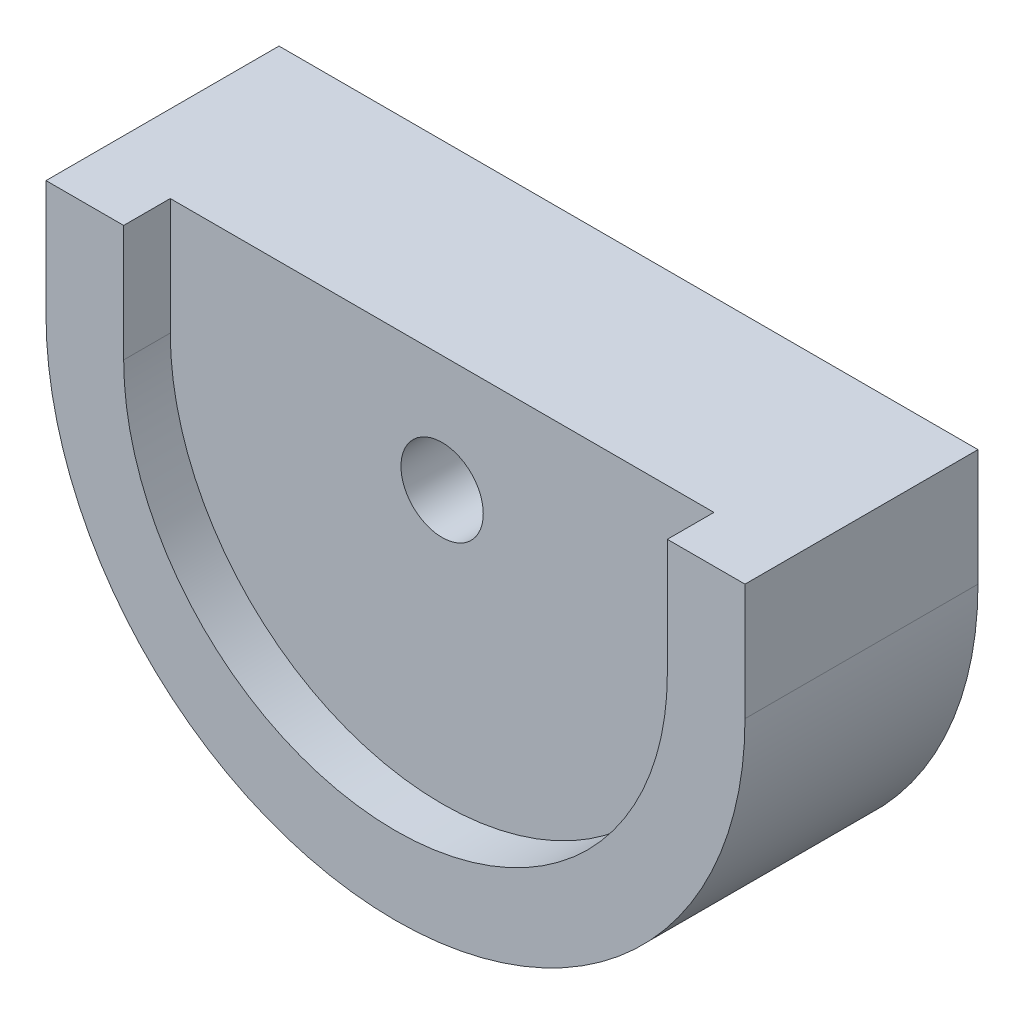
ISO-10303-21;
HEADER;
FILE_DESCRIPTION(('STEP AP214'),'2;1');
FILE_NAME('part.step','',(''),(''),'','','');
FILE_SCHEMA(('AUTOMOTIVE_DESIGN { 1 0 10303 214 1 1 1 1 }'));
ENDSEC;
DATA;
#1=APPLICATION_CONTEXT('core data for automotive mechanical design processes');
#2=APPLICATION_PROTOCOL_DEFINITION('international standard','automotive_design',2000,#1);
#3=PRODUCT_CONTEXT('',#1,'mechanical');
#4=PRODUCT('Part','Part','',(#3));
#5=PRODUCT_RELATED_PRODUCT_CATEGORY('part','',(#4));
#6=PRODUCT_DEFINITION_FORMATION('','',#4);
#7=PRODUCT_DEFINITION_CONTEXT('part definition',#1,'design');
#8=PRODUCT_DEFINITION('design','',#6,#7);
#9=PRODUCT_DEFINITION_SHAPE('','',#8);
#10=(LENGTH_UNIT() NAMED_UNIT(*) SI_UNIT(.MILLI.,.METRE.));
#11=(NAMED_UNIT(*) PLANE_ANGLE_UNIT() SI_UNIT($,.RADIAN.));
#12=(NAMED_UNIT(*) SI_UNIT($,.STERADIAN.) SOLID_ANGLE_UNIT());
#13=UNCERTAINTY_MEASURE_WITH_UNIT(LENGTH_MEASURE(1.E-05),#10,'distance_accuracy_value','');
#14=(GEOMETRIC_REPRESENTATION_CONTEXT(3) GLOBAL_UNCERTAINTY_ASSIGNED_CONTEXT((#13)) GLOBAL_UNIT_ASSIGNED_CONTEXT((#10,
#11,#12)) REPRESENTATION_CONTEXT('',''));
#15=CARTESIAN_POINT('',(0.,0.,0.));
#16=DIRECTION('',(0.,0.,1.));
#17=DIRECTION('',(1.,0.,0.));
#18=AXIS2_PLACEMENT_3D('',#15,#16,#17);
#19=CARTESIAN_POINT('',(22.5,0.,25.));
#20=DIRECTION('',(-1.,0.,0.));
#21=DIRECTION('',(0.,0.,1.));
#22=AXIS2_PLACEMENT_3D('',#19,#20,#21);
#23=PLANE('',#22);
#24=DIRECTION('',(0.,-1.,0.));
#25=VECTOR('',#24,1.);
#26=CARTESIAN_POINT('',(22.5,0.,10.));
#27=LINE('',#26,#25);
#28=CARTESIAN_POINT('',(22.5,7.5,10.));
#29=VERTEX_POINT('',#28);
#30=CARTESIAN_POINT('',(22.5,0.,10.));
#31=VERTEX_POINT('',#30);
#32=EDGE_CURVE('E105',#29,#31,#27,.T.);
#33=ORIENTED_EDGE('',*,*,#32,.F.);
#34=DIRECTION('',(0.,0.,-1.));
#35=VECTOR('',#34,1.);
#36=CARTESIAN_POINT('',(22.5,7.5,42.));
#37=LINE('',#36,#35);
#38=CARTESIAN_POINT('',(22.5,7.5,25.));
#39=VERTEX_POINT('',#38);
#40=EDGE_CURVE('E113',#39,#29,#37,.T.);
#41=ORIENTED_EDGE('',*,*,#40,.F.);
#42=DIRECTION('',(0.,1.,0.));
#43=VECTOR('',#42,1.);
#44=CARTESIAN_POINT('',(22.5,0.,25.));
#45=LINE('',#44,#43);
#46=CARTESIAN_POINT('',(22.5,0.,25.));
#47=VERTEX_POINT('',#46);
#48=EDGE_CURVE('E160',#47,#39,#45,.T.);
#49=ORIENTED_EDGE('',*,*,#48,.F.);
#50=DIRECTION('',(0.,0.,-1.));
#51=VECTOR('',#50,1.);
#52=CARTESIAN_POINT('',(22.5,0.,25.));
#53=LINE('',#52,#51);
#54=EDGE_CURVE('E48',#47,#31,#53,.T.);
#55=ORIENTED_EDGE('',*,*,#54,.T.);
#56=EDGE_LOOP('',(#33,#41,#49,#55));
#57=FACE_BOUND('',#56,.T.);
#58=ADVANCED_FACE('F39',(#57),#23,.F.);
#59=CARTESIAN_POINT('',(-22.5,0.,25.));
#60=DIRECTION('',(1.,0.,0.));
#61=DIRECTION('',(0.,0.,-1.));
#62=AXIS2_PLACEMENT_3D('',#59,#60,#61);
#63=PLANE('',#62);
#64=DIRECTION('',(0.,1.,0.));
#65=VECTOR('',#64,1.);
#66=CARTESIAN_POINT('',(-22.5,0.,10.));
#67=LINE('',#66,#65);
#68=CARTESIAN_POINT('',(-22.5,0.,10.));
#69=VERTEX_POINT('',#68);
#70=CARTESIAN_POINT('',(-22.5,7.5,10.));
#71=VERTEX_POINT('',#70);
#72=EDGE_CURVE('E56',#69,#71,#67,.T.);
#73=ORIENTED_EDGE('',*,*,#72,.F.);
#74=DIRECTION('',(0.,0.,-1.));
#75=VECTOR('',#74,1.);
#76=CARTESIAN_POINT('',(-22.5,0.,25.));
#77=LINE('',#76,#75);
#78=CARTESIAN_POINT('',(-22.5,0.,25.));
#79=VERTEX_POINT('',#78);
#80=EDGE_CURVE('E164',#79,#69,#77,.T.);
#81=ORIENTED_EDGE('',*,*,#80,.F.);
#82=DIRECTION('',(0.,-1.,0.));
#83=VECTOR('',#82,1.);
#84=CARTESIAN_POINT('',(-22.5,0.,25.));
#85=LINE('',#84,#83);
#86=CARTESIAN_POINT('',(-22.5,7.5,25.));
#87=VERTEX_POINT('',#86);
#88=EDGE_CURVE('E162',#87,#79,#85,.T.);
#89=ORIENTED_EDGE('',*,*,#88,.F.);
#90=DIRECTION('',(0.,0.,-1.));
#91=VECTOR('',#90,1.);
#92=CARTESIAN_POINT('',(-22.5,7.5,42.));
#93=LINE('',#92,#91);
#94=EDGE_CURVE('E121',#87,#71,#93,.T.);
#95=ORIENTED_EDGE('',*,*,#94,.T.);
#96=EDGE_LOOP('',(#73,#81,#89,#95));
#97=FACE_BOUND('',#96,.T.);
#98=ADVANCED_FACE('F179',(#97),#63,.F.);
#99=CARTESIAN_POINT('',(0.,0.,25.));
#100=DIRECTION('',(0.,0.,-1.));
#101=DIRECTION('',(-1.,0.,0.));
#102=AXIS2_PLACEMENT_3D('',#99,#100,#101);
#103=CYLINDRICAL_SURFACE('',#102,22.5);
#104=CARTESIAN_POINT('',(0.,0.,10.));
#105=DIRECTION('',(0.,0.,-1.));
#106=DIRECTION('',(-1.,0.,0.));
#107=AXIS2_PLACEMENT_3D('',#104,#105,#106);
#108=CIRCLE('',#107,22.5);
#109=EDGE_CURVE('E116',#31,#69,#108,.T.);
#110=ORIENTED_EDGE('',*,*,#109,.F.);
#111=ORIENTED_EDGE('',*,*,#54,.F.);
#112=CARTESIAN_POINT('',(0.,0.,25.));
#113=DIRECTION('',(0.,0.,1.));
#114=DIRECTION('',(1.,0.,0.));
#115=AXIS2_PLACEMENT_3D('',#112,#113,#114);
#116=CIRCLE('',#115,22.5);
#117=EDGE_CURVE('E155',#79,#47,#116,.T.);
#118=ORIENTED_EDGE('',*,*,#117,.F.);
#119=ORIENTED_EDGE('',*,*,#80,.T.);
#120=EDGE_LOOP('',(#110,#111,#118,#119));
#121=FACE_BOUND('',#120,.T.);
#122=ADVANCED_FACE('F41',(#121),#103,.T.);
#123=CARTESIAN_POINT('',(-22.5,7.5,42.));
#124=DIRECTION('',(0.,1.,0.));
#125=DIRECTION('',(0.,0.,1.));
#126=AXIS2_PLACEMENT_3D('',#123,#124,#125);
#127=PLANE('',#126);
#128=ORIENTED_EDGE('',*,*,#40,.T.);
#129=DIRECTION('',(-1.,0.,0.));
#130=VECTOR('',#129,1.);
#131=CARTESIAN_POINT('',(-22.5,7.5,10.));
#132=LINE('',#131,#130);
#133=EDGE_CURVE('E102',#29,#71,#132,.T.);
#134=ORIENTED_EDGE('',*,*,#133,.T.);
#135=ORIENTED_EDGE('',*,*,#94,.F.);
#136=DIRECTION('',(-1.,0.,0.));
#137=VECTOR('',#136,1.);
#138=CARTESIAN_POINT('',(0.,7.5,25.));
#139=LINE('',#138,#137);
#140=CARTESIAN_POINT('',(-17.5,7.5,25.));
#141=VERTEX_POINT('',#140);
#142=EDGE_CURVE('E134',#141,#87,#139,.T.);
#143=ORIENTED_EDGE('',*,*,#142,.F.);
#144=DIRECTION('',(0.,0.,-1.));
#145=VECTOR('',#144,1.);
#146=CARTESIAN_POINT('',(-17.5,7.5,22.));
#147=LINE('',#146,#145);
#148=CARTESIAN_POINT('',(-17.5,7.5,22.));
#149=VERTEX_POINT('',#148);
#150=EDGE_CURVE('E64',#141,#149,#147,.T.);
#151=ORIENTED_EDGE('',*,*,#150,.T.);
#152=DIRECTION('',(-1.,0.,0.));
#153=VECTOR('',#152,1.);
#154=CARTESIAN_POINT('',(0.,7.5,22.));
#155=LINE('',#154,#153);
#156=CARTESIAN_POINT('',(17.5,7.5,22.));
#157=VERTEX_POINT('',#156);
#158=EDGE_CURVE('E11',#157,#149,#155,.T.);
#159=ORIENTED_EDGE('',*,*,#158,.F.);
#160=DIRECTION('',(0.,0.,-1.));
#161=VECTOR('',#160,1.);
#162=CARTESIAN_POINT('',(17.5,7.5,22.));
#163=LINE('',#162,#161);
#164=CARTESIAN_POINT('',(17.5,7.5,25.));
#165=VERTEX_POINT('',#164);
#166=EDGE_CURVE('E124',#165,#157,#163,.T.);
#167=ORIENTED_EDGE('',*,*,#166,.F.);
#168=EDGE_CURVE('E120',#39,#165,#139,.T.);
#169=ORIENTED_EDGE('',*,*,#168,.F.);
#170=EDGE_LOOP('',(#128,#134,#135,#143,#151,#159,#167,#169));
#171=FACE_BOUND('',#170,.T.);
#172=ADVANCED_FACE('F118',(#171),#127,.T.);
#173=CARTESIAN_POINT('',(0.,0.,15.));
#174=DIRECTION('',(0.,0.,-1.));
#175=DIRECTION('',(-1.,0.,0.));
#176=AXIS2_PLACEMENT_3D('',#173,#174,#175);
#177=CYLINDRICAL_SURFACE('',#176,4.75);
#178=CARTESIAN_POINT('',(0.,0.,15.));
#179=DIRECTION('',(0.,0.,-1.));
#180=DIRECTION('',(-1.,0.,0.));
#181=AXIS2_PLACEMENT_3D('',#178,#179,#180);
#182=CIRCLE('',#181,4.75);
#183=CARTESIAN_POINT('',(-4.75,0.,15.));
#184=VERTEX_POINT('',#183);
#185=EDGE_CURVE('E168',#184,#184,#182,.T.);
#186=ORIENTED_EDGE('',*,*,#185,.F.);
#187=EDGE_LOOP('',(#186));
#188=FACE_BOUND('',#187,.T.);
#189=CARTESIAN_POINT('',(0.,0.,10.));
#190=DIRECTION('',(0.,0.,-1.));
#191=DIRECTION('',(-1.,0.,0.));
#192=AXIS2_PLACEMENT_3D('',#189,#190,#191);
#193=CIRCLE('',#192,4.75);
#194=CARTESIAN_POINT('',(-4.75,0.,10.));
#195=VERTEX_POINT('',#194);
#196=EDGE_CURVE('E43',#195,#195,#193,.F.);
#197=ORIENTED_EDGE('',*,*,#196,.F.);
#198=EDGE_LOOP('',(#197));
#199=FACE_BOUND('',#198,.T.);
#200=ADVANCED_FACE('F231',(#188,#199),#177,.F.);
#201=CARTESIAN_POINT('',(0.,0.,-13.));
#202=DIRECTION('',(0.,0.,1.));
#203=DIRECTION('',(1.,0.,0.));
#204=AXIS2_PLACEMENT_3D('',#201,#202,#203);
#205=CYLINDRICAL_SURFACE('',#204,2.65);
#206=CARTESIAN_POINT('',(0.,0.,22.));
#207=DIRECTION('',(0.,0.,1.));
#208=DIRECTION('',(1.,0.,0.));
#209=AXIS2_PLACEMENT_3D('',#206,#207,#208);
#210=CIRCLE('',#209,2.65);
#211=CARTESIAN_POINT('',(2.65,0.,22.));
#212=VERTEX_POINT('',#211);
#213=EDGE_CURVE('E122',#212,#212,#210,.T.);
#214=ORIENTED_EDGE('',*,*,#213,.T.);
#215=EDGE_LOOP('',(#214));
#216=FACE_BOUND('',#215,.T.);
#217=CARTESIAN_POINT('',(0.,0.,15.));
#218=DIRECTION('',(0.,0.,-1.));
#219=DIRECTION('',(-1.,0.,0.));
#220=AXIS2_PLACEMENT_3D('',#217,#218,#219);
#221=CIRCLE('',#220,2.65);
#222=CARTESIAN_POINT('',(-2.65,0.,15.));
#223=VERTEX_POINT('',#222);
#224=EDGE_CURVE('E127',#223,#223,#221,.F.);
#225=ORIENTED_EDGE('',*,*,#224,.F.);
#226=EDGE_LOOP('',(#225));
#227=FACE_BOUND('',#226,.T.);
#228=ADVANCED_FACE('F221',(#216,#227),#205,.F.);
#229=CARTESIAN_POINT('',(0.,0.,25.));
#230=DIRECTION('',(0.,0.,1.));
#231=DIRECTION('',(1.,0.,0.));
#232=AXIS2_PLACEMENT_3D('',#229,#230,#231);
#233=PLANE('',#232);
#234=ORIENTED_EDGE('',*,*,#48,.T.);
#235=ORIENTED_EDGE('',*,*,#168,.T.);
#236=DIRECTION('',(0.,-1.,0.));
#237=VECTOR('',#236,1.);
#238=CARTESIAN_POINT('',(17.5,0.,25.));
#239=LINE('',#238,#237);
#240=CARTESIAN_POINT('',(17.5,0.,25.));
#241=VERTEX_POINT('',#240);
#242=EDGE_CURVE('E140',#165,#241,#239,.T.);
#243=ORIENTED_EDGE('',*,*,#242,.T.);
#244=CARTESIAN_POINT('',(0.,0.,25.));
#245=DIRECTION('',(0.,0.,1.));
#246=DIRECTION('',(1.,0.,0.));
#247=AXIS2_PLACEMENT_3D('',#244,#245,#246);
#248=CIRCLE('',#247,17.5);
#249=CARTESIAN_POINT('',(-17.5,0.,25.));
#250=VERTEX_POINT('',#249);
#251=EDGE_CURVE('E148',#250,#241,#248,.T.);
#252=ORIENTED_EDGE('',*,*,#251,.F.);
#253=DIRECTION('',(0.,-1.,0.));
#254=VECTOR('',#253,1.);
#255=CARTESIAN_POINT('',(-17.5,0.,25.));
#256=LINE('',#255,#254);
#257=EDGE_CURVE('E146',#141,#250,#256,.T.);
#258=ORIENTED_EDGE('',*,*,#257,.F.);
#259=ORIENTED_EDGE('',*,*,#142,.T.);
#260=ORIENTED_EDGE('',*,*,#88,.T.);
#261=ORIENTED_EDGE('',*,*,#117,.T.);
#262=EDGE_LOOP('',(#234,#235,#243,#252,#258,#259,#260,#261));
#263=FACE_BOUND('',#262,.T.);
#264=ADVANCED_FACE('F183',(#263),#233,.T.);
#265=CARTESIAN_POINT('',(-17.5,0.,22.));
#266=DIRECTION('',(-1.,0.,0.));
#267=DIRECTION('',(0.,0.,1.));
#268=AXIS2_PLACEMENT_3D('',#265,#266,#267);
#269=PLANE('',#268);
#270=ORIENTED_EDGE('',*,*,#150,.F.);
#271=ORIENTED_EDGE('',*,*,#257,.T.);
#272=DIRECTION('',(0.,0.,1.));
#273=VECTOR('',#272,1.);
#274=CARTESIAN_POINT('',(-17.5,0.,22.));
#275=LINE('',#274,#273);
#276=CARTESIAN_POINT('',(-17.5,0.,22.));
#277=VERTEX_POINT('',#276);
#278=EDGE_CURVE('E145',#277,#250,#275,.T.);
#279=ORIENTED_EDGE('',*,*,#278,.F.);
#280=DIRECTION('',(0.,-1.,0.));
#281=VECTOR('',#280,1.);
#282=CARTESIAN_POINT('',(-17.5,0.,22.));
#283=LINE('',#282,#281);
#284=EDGE_CURVE('E137',#149,#277,#283,.T.);
#285=ORIENTED_EDGE('',*,*,#284,.F.);
#286=EDGE_LOOP('',(#270,#271,#279,#285));
#287=FACE_BOUND('',#286,.T.);
#288=ADVANCED_FACE('F188',(#287),#269,.F.);
#289=CARTESIAN_POINT('',(17.5,0.,22.));
#290=DIRECTION('',(-1.,0.,0.));
#291=DIRECTION('',(0.,0.,1.));
#292=AXIS2_PLACEMENT_3D('',#289,#290,#291);
#293=PLANE('',#292);
#294=ORIENTED_EDGE('',*,*,#242,.F.);
#295=ORIENTED_EDGE('',*,*,#166,.T.);
#296=DIRECTION('',(0.,-1.,0.));
#297=VECTOR('',#296,1.);
#298=CARTESIAN_POINT('',(17.5,0.,22.));
#299=LINE('',#298,#297);
#300=CARTESIAN_POINT('',(17.5,0.,22.));
#301=VERTEX_POINT('',#300);
#302=EDGE_CURVE('E143',#157,#301,#299,.T.);
#303=ORIENTED_EDGE('',*,*,#302,.T.);
#304=DIRECTION('',(0.,0.,1.));
#305=VECTOR('',#304,1.);
#306=CARTESIAN_POINT('',(17.5,0.,22.));
#307=LINE('',#306,#305);
#308=EDGE_CURVE('E152',#301,#241,#307,.T.);
#309=ORIENTED_EDGE('',*,*,#308,.T.);
#310=EDGE_LOOP('',(#294,#295,#303,#309));
#311=FACE_BOUND('',#310,.T.);
#312=ADVANCED_FACE('F196',(#311),#293,.T.);
#313=CARTESIAN_POINT('',(0.,0.,22.));
#314=DIRECTION('',(0.,0.,1.));
#315=DIRECTION('',(1.,0.,0.));
#316=AXIS2_PLACEMENT_3D('',#313,#314,#315);
#317=PLANE('',#316);
#318=ORIENTED_EDGE('',*,*,#213,.F.);
#319=EDGE_LOOP('',(#318));
#320=FACE_BOUND('',#319,.T.);
#321=ORIENTED_EDGE('',*,*,#302,.F.);
#322=ORIENTED_EDGE('',*,*,#158,.T.);
#323=ORIENTED_EDGE('',*,*,#284,.T.);
#324=CARTESIAN_POINT('',(0.,0.,22.));
#325=DIRECTION('',(0.,0.,1.));
#326=DIRECTION('',(1.,0.,0.));
#327=AXIS2_PLACEMENT_3D('',#324,#325,#326);
#328=CIRCLE('',#327,17.5);
#329=EDGE_CURVE('E139',#277,#301,#328,.T.);
#330=ORIENTED_EDGE('',*,*,#329,.T.);
#331=EDGE_LOOP('',(#321,#322,#323,#330));
#332=FACE_BOUND('',#331,.T.);
#333=ADVANCED_FACE('F193',(#320,#332),#317,.T.);
#334=CARTESIAN_POINT('',(0.,0.,22.));
#335=DIRECTION('',(0.,0.,1.));
#336=DIRECTION('',(1.,0.,0.));
#337=AXIS2_PLACEMENT_3D('',#334,#335,#336);
#338=CYLINDRICAL_SURFACE('',#337,17.5);
#339=ORIENTED_EDGE('',*,*,#251,.T.);
#340=ORIENTED_EDGE('',*,*,#308,.F.);
#341=ORIENTED_EDGE('',*,*,#329,.F.);
#342=ORIENTED_EDGE('',*,*,#278,.T.);
#343=EDGE_LOOP('',(#339,#340,#341,#342));
#344=FACE_BOUND('',#343,.T.);
#345=ADVANCED_FACE('F199',(#344),#338,.F.);
#346=CARTESIAN_POINT('',(0.,0.,15.));
#347=DIRECTION('',(0.,0.,-1.));
#348=DIRECTION('',(-1.,0.,0.));
#349=AXIS2_PLACEMENT_3D('',#346,#347,#348);
#350=PLANE('',#349);
#351=ORIENTED_EDGE('',*,*,#185,.T.);
#352=EDGE_LOOP('',(#351));
#353=FACE_BOUND('',#352,.T.);
#354=ORIENTED_EDGE('',*,*,#224,.T.);
#355=EDGE_LOOP('',(#354));
#356=FACE_BOUND('',#355,.T.);
#357=ADVANCED_FACE('F201',(#353,#356),#350,.T.);
#358=CARTESIAN_POINT('',(0.,0.,10.));
#359=DIRECTION('',(0.,0.,-1.));
#360=DIRECTION('',(-1.,0.,0.));
#361=AXIS2_PLACEMENT_3D('',#358,#359,#360);
#362=PLANE('',#361);
#363=ORIENTED_EDGE('',*,*,#196,.T.);
#364=EDGE_LOOP('',(#363));
#365=FACE_BOUND('',#364,.T.);
#366=ORIENTED_EDGE('',*,*,#109,.T.);
#367=ORIENTED_EDGE('',*,*,#72,.T.);
#368=ORIENTED_EDGE('',*,*,#133,.F.);
#369=ORIENTED_EDGE('',*,*,#32,.T.);
#370=EDGE_LOOP('',(#366,#367,#368,#369));
#371=FACE_BOUND('',#370,.T.);
#372=ADVANCED_FACE('F104',(#365,#371),#362,.T.);
#373=CLOSED_SHELL('',(#58,#98,#122,#172,#200,#228,#264,#288,#312,#333,#345,#357,#372));
#374=MANIFOLD_SOLID_BREP('B2',#373);
#375=ADVANCED_BREP_SHAPE_REPRESENTATION('',(#18,#374),#14);
#376=SHAPE_DEFINITION_REPRESENTATION(#9,#375);
ENDSEC;
END-ISO-10303-21;
